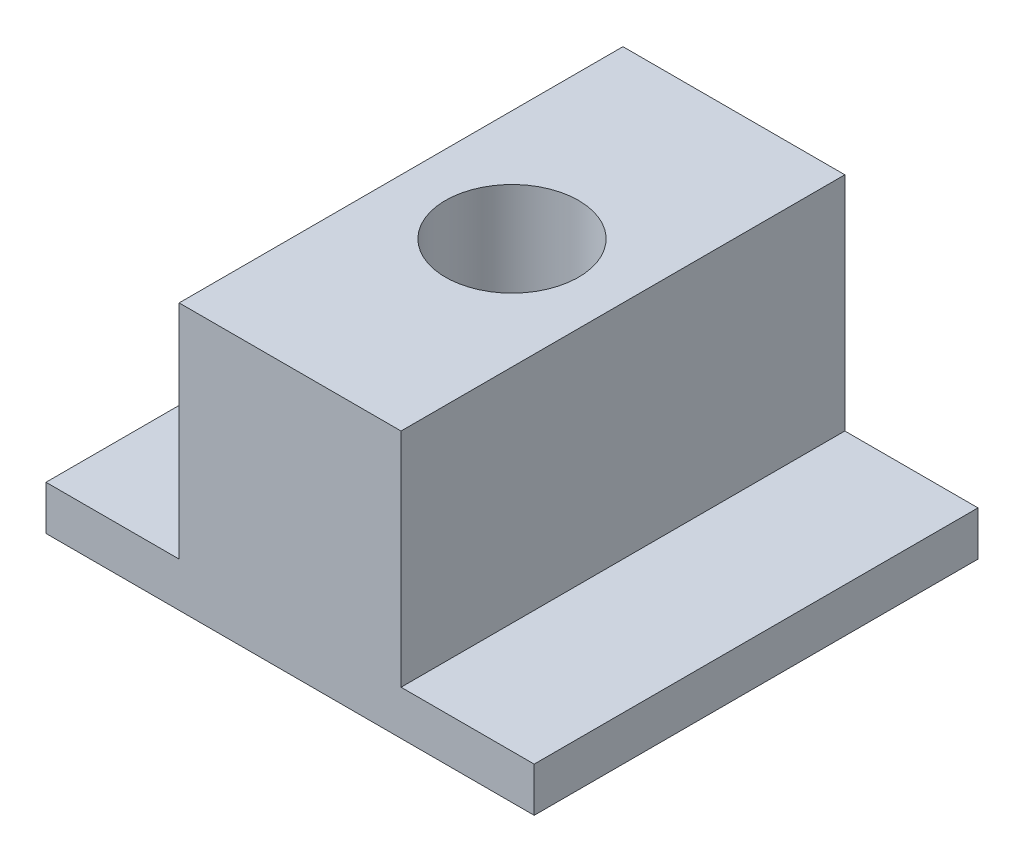
ISO-10303-21;
HEADER;
FILE_DESCRIPTION(('STEP AP214'),'2;1');
FILE_NAME('part.step','',(''),(''),'','','');
FILE_SCHEMA(('AUTOMOTIVE_DESIGN { 1 0 10303 214 1 1 1 1 }'));
ENDSEC;
DATA;
#1=APPLICATION_CONTEXT('core data for automotive mechanical design processes');
#2=APPLICATION_PROTOCOL_DEFINITION('international standard','automotive_design',2000,#1);
#3=PRODUCT_CONTEXT('',#1,'mechanical');
#4=PRODUCT('Part','Part','',(#3));
#5=PRODUCT_RELATED_PRODUCT_CATEGORY('part','',(#4));
#6=PRODUCT_DEFINITION_FORMATION('','',#4);
#7=PRODUCT_DEFINITION_CONTEXT('part definition',#1,'design');
#8=PRODUCT_DEFINITION('design','',#6,#7);
#9=PRODUCT_DEFINITION_SHAPE('','',#8);
#10=(LENGTH_UNIT() NAMED_UNIT(*) SI_UNIT(.MILLI.,.METRE.));
#11=(NAMED_UNIT(*) PLANE_ANGLE_UNIT() SI_UNIT($,.RADIAN.));
#12=(NAMED_UNIT(*) SI_UNIT($,.STERADIAN.) SOLID_ANGLE_UNIT());
#13=UNCERTAINTY_MEASURE_WITH_UNIT(LENGTH_MEASURE(1.E-05),#10,'distance_accuracy_value','');
#14=(GEOMETRIC_REPRESENTATION_CONTEXT(3) GLOBAL_UNCERTAINTY_ASSIGNED_CONTEXT((#13)) GLOBAL_UNIT_ASSIGNED_CONTEXT((#10,
#11,#12)) REPRESENTATION_CONTEXT('',''));
#15=CARTESIAN_POINT('',(0.,0.,0.));
#16=DIRECTION('',(0.,0.,1.));
#17=DIRECTION('',(1.,0.,0.));
#18=AXIS2_PLACEMENT_3D('',#15,#16,#17);
#19=CARTESIAN_POINT('',(2.5,5.,5.));
#20=DIRECTION('',(-1.,0.,0.));
#21=DIRECTION('',(0.,0.,1.));
#22=AXIS2_PLACEMENT_3D('',#19,#20,#21);
#23=PLANE('',#22);
#24=DIRECTION('',(0.,0.,-1.));
#25=VECTOR('',#24,1.);
#26=CARTESIAN_POINT('',(2.5,0.,5.));
#27=LINE('',#26,#25);
#28=CARTESIAN_POINT('',(2.5,0.,5.));
#29=VERTEX_POINT('',#28);
#30=CARTESIAN_POINT('',(2.5,0.,-5.));
#31=VERTEX_POINT('',#30);
#32=EDGE_CURVE('E120',#29,#31,#27,.T.);
#33=ORIENTED_EDGE('',*,*,#32,.T.);
#34=DIRECTION('',(0.,-1.,0.));
#35=VECTOR('',#34,1.);
#36=CARTESIAN_POINT('',(2.5,5.,-5.));
#37=LINE('',#36,#35);
#38=CARTESIAN_POINT('',(2.5,5.,-5.));
#39=VERTEX_POINT('',#38);
#40=EDGE_CURVE('E11',#39,#31,#37,.T.);
#41=ORIENTED_EDGE('',*,*,#40,.F.);
#42=DIRECTION('',(0.,0.,-1.));
#43=VECTOR('',#42,1.);
#44=CARTESIAN_POINT('',(2.5,5.,5.));
#45=LINE('',#44,#43);
#46=CARTESIAN_POINT('',(2.5,5.,5.));
#47=VERTEX_POINT('',#46);
#48=EDGE_CURVE('E129',#47,#39,#45,.T.);
#49=ORIENTED_EDGE('',*,*,#48,.F.);
#50=DIRECTION('',(0.,-1.,0.));
#51=VECTOR('',#50,1.);
#52=CARTESIAN_POINT('',(2.5,5.,5.));
#53=LINE('',#52,#51);
#54=EDGE_CURVE('E135',#47,#29,#53,.T.);
#55=ORIENTED_EDGE('',*,*,#54,.T.);
#56=EDGE_LOOP('',(#33,#41,#49,#55));
#57=FACE_BOUND('',#56,.T.);
#58=ADVANCED_FACE('F33',(#57),#23,.F.);
#59=CARTESIAN_POINT('',(-2.5,5.,-5.));
#60=DIRECTION('',(0.,0.,1.));
#61=DIRECTION('',(1.,0.,0.));
#62=AXIS2_PLACEMENT_3D('',#59,#60,#61);
#63=PLANE('',#62);
#64=ORIENTED_EDGE('',*,*,#40,.T.);
#65=DIRECTION('',(1.,0.,0.));
#66=VECTOR('',#65,1.);
#67=CARTESIAN_POINT('',(-5.5,0.,-5.));
#68=LINE('',#67,#66);
#69=CARTESIAN_POINT('',(5.5,0.,-5.));
#70=VERTEX_POINT('',#69);
#71=EDGE_CURVE('E156',#31,#70,#68,.T.);
#72=ORIENTED_EDGE('',*,*,#71,.T.);
#73=DIRECTION('',(0.,1.,0.));
#74=VECTOR('',#73,1.);
#75=CARTESIAN_POINT('',(5.5,-1.,-5.));
#76=LINE('',#75,#74);
#77=CARTESIAN_POINT('',(5.5,-1.,-5.));
#78=VERTEX_POINT('',#77);
#79=EDGE_CURVE('E162',#78,#70,#76,.T.);
#80=ORIENTED_EDGE('',*,*,#79,.F.);
#81=DIRECTION('',(1.,0.,0.));
#82=VECTOR('',#81,1.);
#83=CARTESIAN_POINT('',(-5.5,-1.,-5.));
#84=LINE('',#83,#82);
#85=CARTESIAN_POINT('',(-5.5,-1.,-5.));
#86=VERTEX_POINT('',#85);
#87=EDGE_CURVE('E111',#86,#78,#84,.T.);
#88=ORIENTED_EDGE('',*,*,#87,.F.);
#89=DIRECTION('',(0.,1.,0.));
#90=VECTOR('',#89,1.);
#91=CARTESIAN_POINT('',(-5.5,-1.,-5.));
#92=LINE('',#91,#90);
#93=CARTESIAN_POINT('',(-5.5,0.,-5.));
#94=VERTEX_POINT('',#93);
#95=EDGE_CURVE('E125',#86,#94,#92,.T.);
#96=ORIENTED_EDGE('',*,*,#95,.T.);
#97=CARTESIAN_POINT('',(-2.5,0.,-5.));
#98=VERTEX_POINT('',#97);
#99=EDGE_CURVE('E115',#94,#98,#68,.T.);
#100=ORIENTED_EDGE('',*,*,#99,.T.);
#101=DIRECTION('',(0.,-1.,0.));
#102=VECTOR('',#101,1.);
#103=CARTESIAN_POINT('',(-2.5,5.,-5.));
#104=LINE('',#103,#102);
#105=CARTESIAN_POINT('',(-2.5,5.,-5.));
#106=VERTEX_POINT('',#105);
#107=EDGE_CURVE('E41',#106,#98,#104,.T.);
#108=ORIENTED_EDGE('',*,*,#107,.F.);
#109=DIRECTION('',(-1.,0.,0.));
#110=VECTOR('',#109,1.);
#111=CARTESIAN_POINT('',(-2.5,5.,-5.));
#112=LINE('',#111,#110);
#113=EDGE_CURVE('E131',#39,#106,#112,.T.);
#114=ORIENTED_EDGE('',*,*,#113,.F.);
#115=EDGE_LOOP('',(#64,#72,#80,#88,#96,#100,#108,#114));
#116=FACE_BOUND('',#115,.T.);
#117=ADVANCED_FACE('F150',(#116),#63,.F.);
#118=CARTESIAN_POINT('',(-2.5,5.,5.));
#119=DIRECTION('',(1.,0.,0.));
#120=DIRECTION('',(0.,0.,-1.));
#121=AXIS2_PLACEMENT_3D('',#118,#119,#120);
#122=PLANE('',#121);
#123=DIRECTION('',(0.,0.,1.));
#124=VECTOR('',#123,1.);
#125=CARTESIAN_POINT('',(-2.5,0.,5.));
#126=LINE('',#125,#124);
#127=CARTESIAN_POINT('',(-2.5,0.,5.));
#128=VERTEX_POINT('',#127);
#129=EDGE_CURVE('E123',#98,#128,#126,.T.);
#130=ORIENTED_EDGE('',*,*,#129,.T.);
#131=DIRECTION('',(0.,-1.,0.));
#132=VECTOR('',#131,1.);
#133=CARTESIAN_POINT('',(-2.5,5.,5.));
#134=LINE('',#133,#132);
#135=CARTESIAN_POINT('',(-2.5,5.,5.));
#136=VERTEX_POINT('',#135);
#137=EDGE_CURVE('E141',#136,#128,#134,.T.);
#138=ORIENTED_EDGE('',*,*,#137,.F.);
#139=DIRECTION('',(0.,0.,1.));
#140=VECTOR('',#139,1.);
#141=CARTESIAN_POINT('',(-2.5,5.,5.));
#142=LINE('',#141,#140);
#143=EDGE_CURVE('E133',#106,#136,#142,.T.);
#144=ORIENTED_EDGE('',*,*,#143,.F.);
#145=ORIENTED_EDGE('',*,*,#107,.T.);
#146=EDGE_LOOP('',(#130,#138,#144,#145));
#147=FACE_BOUND('',#146,.T.);
#148=ADVANCED_FACE('F146',(#147),#122,.F.);
#149=CARTESIAN_POINT('',(-2.5,5.,5.));
#150=DIRECTION('',(0.,0.,-1.));
#151=DIRECTION('',(-1.,0.,0.));
#152=AXIS2_PLACEMENT_3D('',#149,#150,#151);
#153=PLANE('',#152);
#154=ORIENTED_EDGE('',*,*,#137,.T.);
#155=DIRECTION('',(-1.,0.,0.));
#156=VECTOR('',#155,1.);
#157=CARTESIAN_POINT('',(-5.5,0.,5.));
#158=LINE('',#157,#156);
#159=CARTESIAN_POINT('',(-5.5,0.,5.));
#160=VERTEX_POINT('',#159);
#161=EDGE_CURVE('E166',#128,#160,#158,.T.);
#162=ORIENTED_EDGE('',*,*,#161,.T.);
#163=DIRECTION('',(0.,1.,0.));
#164=VECTOR('',#163,1.);
#165=CARTESIAN_POINT('',(-5.5,-1.,5.));
#166=LINE('',#165,#164);
#167=CARTESIAN_POINT('',(-5.5,-1.,5.));
#168=VERTEX_POINT('',#167);
#169=EDGE_CURVE('E102',#168,#160,#166,.T.);
#170=ORIENTED_EDGE('',*,*,#169,.F.);
#171=DIRECTION('',(-1.,0.,0.));
#172=VECTOR('',#171,1.);
#173=CARTESIAN_POINT('',(-5.5,-1.,5.));
#174=LINE('',#173,#172);
#175=CARTESIAN_POINT('',(5.5,-1.,5.));
#176=VERTEX_POINT('',#175);
#177=EDGE_CURVE('E93',#176,#168,#174,.T.);
#178=ORIENTED_EDGE('',*,*,#177,.F.);
#179=DIRECTION('',(0.,1.,0.));
#180=VECTOR('',#179,1.);
#181=CARTESIAN_POINT('',(5.5,-1.,5.));
#182=LINE('',#181,#180);
#183=CARTESIAN_POINT('',(5.5,0.,5.));
#184=VERTEX_POINT('',#183);
#185=EDGE_CURVE('E99',#176,#184,#182,.T.);
#186=ORIENTED_EDGE('',*,*,#185,.T.);
#187=EDGE_CURVE('E168',#184,#29,#158,.T.);
#188=ORIENTED_EDGE('',*,*,#187,.T.);
#189=ORIENTED_EDGE('',*,*,#54,.F.);
#190=DIRECTION('',(1.,0.,0.));
#191=VECTOR('',#190,1.);
#192=CARTESIAN_POINT('',(-2.5,5.,5.));
#193=LINE('',#192,#191);
#194=EDGE_CURVE('E48',#136,#47,#193,.T.);
#195=ORIENTED_EDGE('',*,*,#194,.F.);
#196=EDGE_LOOP('',(#154,#162,#170,#178,#186,#188,#189,#195));
#197=FACE_BOUND('',#196,.T.);
#198=ADVANCED_FACE('F96',(#197),#153,.F.);
#199=CARTESIAN_POINT('',(0.,5.,0.));
#200=DIRECTION('',(0.,-1.,0.));
#201=DIRECTION('',(0.,0.,-1.));
#202=AXIS2_PLACEMENT_3D('',#199,#200,#201);
#203=PLANE('',#202);
#204=CARTESIAN_POINT('',(0.,5.,0.));
#205=DIRECTION('',(0.,-1.,0.));
#206=DIRECTION('',(0.,0.,-1.));
#207=AXIS2_PLACEMENT_3D('',#204,#205,#206);
#208=CIRCLE('',#207,1.5);
#209=CARTESIAN_POINT('',(0.,5.,-1.5));
#210=VERTEX_POINT('',#209);
#211=EDGE_CURVE('E167',#210,#210,#208,.T.);
#212=ORIENTED_EDGE('',*,*,#211,.T.);
#213=EDGE_LOOP('',(#212));
#214=FACE_BOUND('',#213,.T.);
#215=ORIENTED_EDGE('',*,*,#48,.T.);
#216=ORIENTED_EDGE('',*,*,#113,.T.);
#217=ORIENTED_EDGE('',*,*,#143,.T.);
#218=ORIENTED_EDGE('',*,*,#194,.T.);
#219=EDGE_LOOP('',(#215,#216,#217,#218));
#220=FACE_BOUND('',#219,.T.);
#221=ADVANCED_FACE('F188',(#214,#220),#203,.F.);
#222=CARTESIAN_POINT('',(0.,0.,0.));
#223=DIRECTION('',(0.,-1.,0.));
#224=DIRECTION('',(0.,0.,-1.));
#225=AXIS2_PLACEMENT_3D('',#222,#223,#224);
#226=PLANE('',#225);
#227=ORIENTED_EDGE('',*,*,#32,.F.);
#228=ORIENTED_EDGE('',*,*,#187,.F.);
#229=DIRECTION('',(0.,0.,1.));
#230=VECTOR('',#229,1.);
#231=CARTESIAN_POINT('',(5.5,0.,5.));
#232=LINE('',#231,#230);
#233=EDGE_CURVE('E119',#70,#184,#232,.T.);
#234=ORIENTED_EDGE('',*,*,#233,.F.);
#235=ORIENTED_EDGE('',*,*,#71,.F.);
#236=EDGE_LOOP('',(#227,#228,#234,#235));
#237=FACE_BOUND('',#236,.T.);
#238=ADVANCED_FACE('F176',(#237),#226,.F.);
#239=CARTESIAN_POINT('',(5.5,-1.,5.));
#240=DIRECTION('',(-1.,0.,0.));
#241=DIRECTION('',(0.,0.,1.));
#242=AXIS2_PLACEMENT_3D('',#239,#240,#241);
#243=PLANE('',#242);
#244=ORIENTED_EDGE('',*,*,#233,.T.);
#245=ORIENTED_EDGE('',*,*,#185,.F.);
#246=DIRECTION('',(0.,0.,1.));
#247=VECTOR('',#246,1.);
#248=CARTESIAN_POINT('',(5.5,-1.,5.));
#249=LINE('',#248,#247);
#250=EDGE_CURVE('E106',#78,#176,#249,.T.);
#251=ORIENTED_EDGE('',*,*,#250,.F.);
#252=ORIENTED_EDGE('',*,*,#79,.T.);
#253=EDGE_LOOP('',(#244,#245,#251,#252));
#254=FACE_BOUND('',#253,.T.);
#255=ADVANCED_FACE('F117',(#254),#243,.F.);
#256=CARTESIAN_POINT('',(-5.5,-1.,5.));
#257=DIRECTION('',(1.,0.,0.));
#258=DIRECTION('',(0.,0.,-1.));
#259=AXIS2_PLACEMENT_3D('',#256,#257,#258);
#260=PLANE('',#259);
#261=DIRECTION('',(0.,0.,-1.));
#262=VECTOR('',#261,1.);
#263=CARTESIAN_POINT('',(-5.5,0.,5.));
#264=LINE('',#263,#262);
#265=EDGE_CURVE('E158',#160,#94,#264,.T.);
#266=ORIENTED_EDGE('',*,*,#265,.T.);
#267=ORIENTED_EDGE('',*,*,#95,.F.);
#268=DIRECTION('',(0.,0.,-1.));
#269=VECTOR('',#268,1.);
#270=CARTESIAN_POINT('',(-5.5,-1.,5.));
#271=LINE('',#270,#269);
#272=EDGE_CURVE('E105',#168,#86,#271,.T.);
#273=ORIENTED_EDGE('',*,*,#272,.F.);
#274=ORIENTED_EDGE('',*,*,#169,.T.);
#275=EDGE_LOOP('',(#266,#267,#273,#274));
#276=FACE_BOUND('',#275,.T.);
#277=ADVANCED_FACE('F171',(#276),#260,.F.);
#278=CARTESIAN_POINT('',(0.,-1.,0.));
#279=DIRECTION('',(0.,-1.,0.));
#280=DIRECTION('',(0.,0.,-1.));
#281=AXIS2_PLACEMENT_3D('',#278,#279,#280);
#282=PLANE('',#281);
#283=CARTESIAN_POINT('',(0.,-1.,0.));
#284=DIRECTION('',(0.,-1.,0.));
#285=DIRECTION('',(0.,0.,-1.));
#286=AXIS2_PLACEMENT_3D('',#283,#284,#285);
#287=CIRCLE('',#286,1.5);
#288=CARTESIAN_POINT('',(0.,-1.,-1.5));
#289=VERTEX_POINT('',#288);
#290=EDGE_CURVE('E276',#289,#289,#287,.T.);
#291=ORIENTED_EDGE('',*,*,#290,.F.);
#292=EDGE_LOOP('',(#291));
#293=FACE_BOUND('',#292,.T.);
#294=ORIENTED_EDGE('',*,*,#250,.T.);
#295=ORIENTED_EDGE('',*,*,#177,.T.);
#296=ORIENTED_EDGE('',*,*,#272,.T.);
#297=ORIENTED_EDGE('',*,*,#87,.T.);
#298=EDGE_LOOP('',(#294,#295,#296,#297));
#299=FACE_BOUND('',#298,.T.);
#300=ADVANCED_FACE('F109',(#293,#299),#282,.T.);
#301=ORIENTED_EDGE('',*,*,#129,.F.);
#302=ORIENTED_EDGE('',*,*,#99,.F.);
#303=ORIENTED_EDGE('',*,*,#265,.F.);
#304=ORIENTED_EDGE('',*,*,#161,.F.);
#305=EDGE_LOOP('',(#301,#302,#303,#304));
#306=FACE_BOUND('',#305,.T.);
#307=ADVANCED_FACE('F172',(#306),#226,.F.);
#308=CARTESIAN_POINT('',(0.,5.,0.));
#309=DIRECTION('',(0.,-1.,0.));
#310=DIRECTION('',(0.,0.,-1.));
#311=AXIS2_PLACEMENT_3D('',#308,#309,#310);
#312=CYLINDRICAL_SURFACE('',#311,1.5);
#313=ORIENTED_EDGE('',*,*,#211,.F.);
#314=EDGE_LOOP('',(#313));
#315=FACE_BOUND('',#314,.T.);
#316=ORIENTED_EDGE('',*,*,#290,.T.);
#317=EDGE_LOOP('',(#316));
#318=FACE_BOUND('',#317,.T.);
#319=ADVANCED_FACE('F174',(#315,#318),#312,.F.);
#320=CLOSED_SHELL('',(#58,#117,#148,#198,#221,#238,#255,#277,#300,#307,#319));
#321=MANIFOLD_SOLID_BREP('B2',#320);
#322=ADVANCED_BREP_SHAPE_REPRESENTATION('',(#18,#321),#14);
#323=SHAPE_DEFINITION_REPRESENTATION(#9,#322);
ENDSEC;
END-ISO-10303-21;
